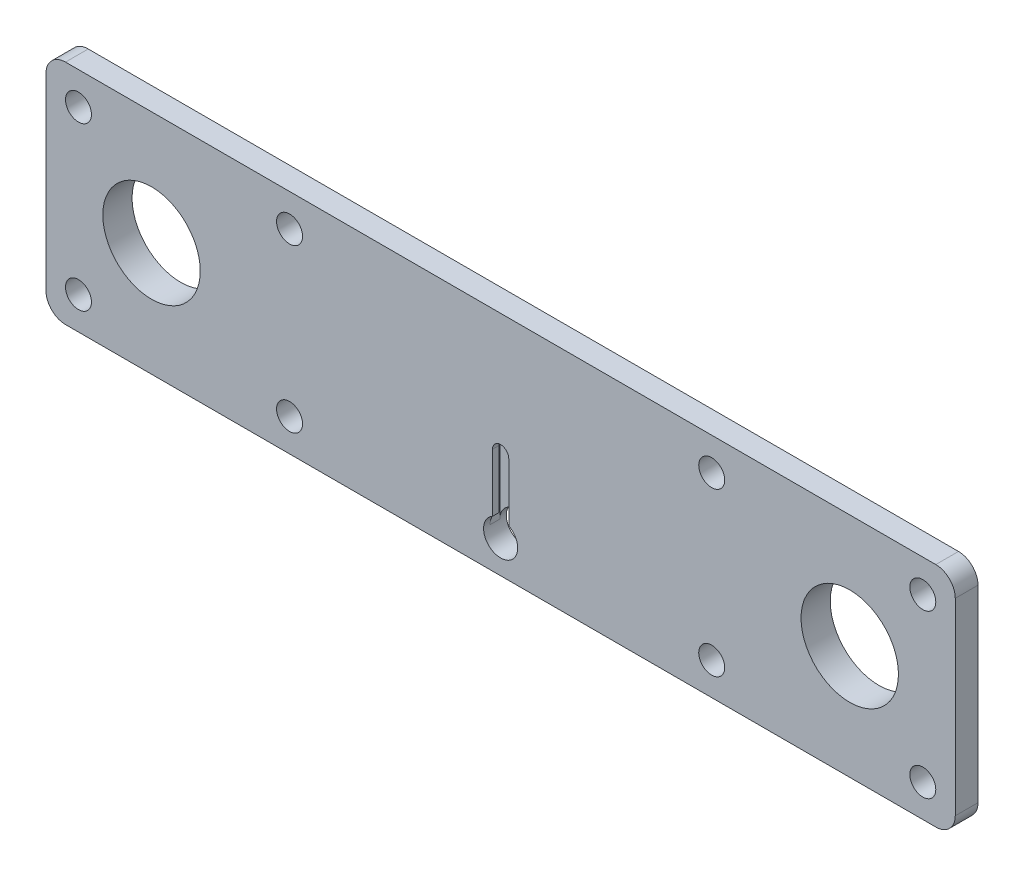
ISO-10303-21;
HEADER;
FILE_DESCRIPTION(('STEP AP214'),'2;1');
FILE_NAME('part.step','',(''),(''),'','','');
FILE_SCHEMA(('AUTOMOTIVE_DESIGN { 1 0 10303 214 1 1 1 1 }'));
ENDSEC;
DATA;
#1=APPLICATION_CONTEXT('core data for automotive mechanical design processes');
#2=APPLICATION_PROTOCOL_DEFINITION('international standard','automotive_design',2000,#1);
#3=PRODUCT_CONTEXT('',#1,'mechanical');
#4=PRODUCT('Part','Part','',(#3));
#5=PRODUCT_RELATED_PRODUCT_CATEGORY('part','',(#4));
#6=PRODUCT_DEFINITION_FORMATION('','',#4);
#7=PRODUCT_DEFINITION_CONTEXT('part definition',#1,'design');
#8=PRODUCT_DEFINITION('design','',#6,#7);
#9=PRODUCT_DEFINITION_SHAPE('','',#8);
#10=(LENGTH_UNIT() NAMED_UNIT(*) SI_UNIT(.MILLI.,.METRE.));
#11=(NAMED_UNIT(*) PLANE_ANGLE_UNIT() SI_UNIT($,.RADIAN.));
#12=(NAMED_UNIT(*) SI_UNIT($,.STERADIAN.) SOLID_ANGLE_UNIT());
#13=UNCERTAINTY_MEASURE_WITH_UNIT(LENGTH_MEASURE(1.E-05),#10,'distance_accuracy_value','');
#14=(GEOMETRIC_REPRESENTATION_CONTEXT(3) GLOBAL_UNCERTAINTY_ASSIGNED_CONTEXT((#13)) GLOBAL_UNIT_ASSIGNED_CONTEXT((#10,
#11,#12)) REPRESENTATION_CONTEXT('',''));
#15=CARTESIAN_POINT('',(0.,0.,0.));
#16=DIRECTION('',(0.,0.,1.));
#17=DIRECTION('',(1.,0.,0.));
#18=AXIS2_PLACEMENT_3D('',#15,#16,#17);
#19=CARTESIAN_POINT('',(0.,-2.5,10.));
#20=DIRECTION('',(0.,0.,-1.));
#21=DIRECTION('',(-1.,0.,0.));
#22=AXIS2_PLACEMENT_3D('',#19,#20,#21);
#23=CYLINDRICAL_SURFACE('',#22,2.5);
#24=CARTESIAN_POINT('',(0.,-2.5,2.));
#25=DIRECTION('',(0.,0.,1.));
#26=DIRECTION('',(1.,0.,0.));
#27=AXIS2_PLACEMENT_3D('',#24,#25,#26);
#28=CIRCLE('',#27,2.5);
#29=CARTESIAN_POINT('',(-2.5,-2.5,2.));
#30=VERTEX_POINT('',#29);
#31=CARTESIAN_POINT('',(2.5,-2.5,2.));
#32=VERTEX_POINT('',#31);
#33=EDGE_CURVE('E50',#30,#32,#28,.F.);
#34=ORIENTED_EDGE('',*,*,#33,.F.);
#35=DIRECTION('',(0.,0.,-1.));
#36=VECTOR('',#35,1.);
#37=CARTESIAN_POINT('',(-2.5,-2.5,10.));
#38=LINE('',#37,#36);
#39=CARTESIAN_POINT('',(-2.5,-2.5,0.));
#40=VERTEX_POINT('',#39);
#41=EDGE_CURVE('E261',#30,#40,#38,.T.);
#42=ORIENTED_EDGE('',*,*,#41,.T.);
#43=CARTESIAN_POINT('',(0.,-2.5,0.));
#44=DIRECTION('',(0.,0.,-1.));
#45=DIRECTION('',(1.,0.,0.));
#46=AXIS2_PLACEMENT_3D('',#43,#44,#45);
#47=CIRCLE('',#46,2.5);
#48=CARTESIAN_POINT('',(2.5,-2.5,0.));
#49=VERTEX_POINT('',#48);
#50=EDGE_CURVE('E245',#40,#49,#47,.T.);
#51=ORIENTED_EDGE('',*,*,#50,.T.);
#52=DIRECTION('',(0.,0.,-1.));
#53=VECTOR('',#52,1.);
#54=CARTESIAN_POINT('',(2.5,-2.5,10.));
#55=LINE('',#54,#53);
#56=EDGE_CURVE('E258',#32,#49,#55,.T.);
#57=ORIENTED_EDGE('',*,*,#56,.F.);
#58=EDGE_LOOP('',(#34,#42,#51,#57));
#59=FACE_BOUND('',#58,.T.);
#60=ADVANCED_FACE('F35',(#59),#23,.F.);
#61=CARTESIAN_POINT('',(-2.5,-2.5,10.));
#62=DIRECTION('',(-1.,0.,0.));
#63=DIRECTION('',(0.,0.,1.));
#64=AXIS2_PLACEMENT_3D('',#61,#62,#63);
#65=PLANE('',#64);
#66=DIRECTION('',(0.,1.,0.));
#67=VECTOR('',#66,1.);
#68=CARTESIAN_POINT('',(-2.5,-2.5,2.));
#69=LINE('',#68,#67);
#70=CARTESIAN_POINT('',(-2.5,-20.3834536718452,2.));
#71=VERTEX_POINT('',#70);
#72=EDGE_CURVE('E213',#71,#30,#69,.T.);
#73=ORIENTED_EDGE('',*,*,#72,.F.);
#74=DIRECTION('',(0.,0.,-1.));
#75=VECTOR('',#74,1.);
#76=CARTESIAN_POINT('',(-2.5,-20.3834536718452,10.));
#77=LINE('',#76,#75);
#78=CARTESIAN_POINT('',(-2.5,-20.3834536718452,0.));
#79=VERTEX_POINT('',#78);
#80=EDGE_CURVE('E265',#71,#79,#77,.T.);
#81=ORIENTED_EDGE('',*,*,#80,.T.);
#82=DIRECTION('',(0.,1.,0.));
#83=VECTOR('',#82,1.);
#84=CARTESIAN_POINT('',(-2.5,-2.5,0.));
#85=LINE('',#84,#83);
#86=EDGE_CURVE('E255',#79,#40,#85,.T.);
#87=ORIENTED_EDGE('',*,*,#86,.T.);
#88=ORIENTED_EDGE('',*,*,#41,.F.);
#89=EDGE_LOOP('',(#73,#81,#87,#88));
#90=FACE_BOUND('',#89,.T.);
#91=ADVANCED_FACE('F409',(#90),#65,.F.);
#92=CARTESIAN_POINT('',(2.5,-2.5,10.));
#93=DIRECTION('',(1.,0.,0.));
#94=DIRECTION('',(0.,0.,-1.));
#95=AXIS2_PLACEMENT_3D('',#92,#93,#94);
#96=PLANE('',#95);
#97=DIRECTION('',(0.,-1.,0.));
#98=VECTOR('',#97,1.);
#99=CARTESIAN_POINT('',(2.5,-2.5,2.));
#100=LINE('',#99,#98);
#101=CARTESIAN_POINT('',(2.5,-20.3834536718452,2.));
#102=VERTEX_POINT('',#101);
#103=EDGE_CURVE('E43',#32,#102,#100,.T.);
#104=ORIENTED_EDGE('',*,*,#103,.F.);
#105=ORIENTED_EDGE('',*,*,#56,.T.);
#106=DIRECTION('',(0.,-1.,0.));
#107=VECTOR('',#106,1.);
#108=CARTESIAN_POINT('',(2.5,-2.5,0.));
#109=LINE('',#108,#107);
#110=CARTESIAN_POINT('',(2.5,-20.3834536718452,0.));
#111=VERTEX_POINT('',#110);
#112=EDGE_CURVE('E248',#49,#111,#109,.T.);
#113=ORIENTED_EDGE('',*,*,#112,.T.);
#114=DIRECTION('',(0.,0.,-1.));
#115=VECTOR('',#114,1.);
#116=CARTESIAN_POINT('',(2.5,-20.3834536718452,10.));
#117=LINE('',#116,#115);
#118=EDGE_CURVE('E267',#102,#111,#117,.T.);
#119=ORIENTED_EDGE('',*,*,#118,.F.);
#120=EDGE_LOOP('',(#104,#105,#113,#119));
#121=FACE_BOUND('',#120,.T.);
#122=ADVANCED_FACE('F397',(#121),#96,.F.);
#123=CARTESIAN_POINT('',(0.,0.,0.));
#124=DIRECTION('',(0.,0.,1.));
#125=DIRECTION('',(1.,0.,0.));
#126=AXIS2_PLACEMENT_3D('',#123,#124,#125);
#127=PLANE('',#126);
#128=CARTESIAN_POINT('',(107.5,0.,0.));
#129=DIRECTION('',(0.,0.,1.));
#130=DIRECTION('',(1.,0.,0.));
#131=AXIS2_PLACEMENT_3D('',#128,#129,#130);
#132=CIRCLE('',#131,20.);
#133=CARTESIAN_POINT('',(127.5,0.,0.));
#134=VERTEX_POINT('',#133);
#135=EDGE_CURVE('E384',#134,#134,#132,.F.);
#136=ORIENTED_EDGE('',*,*,#135,.F.);
#137=EDGE_LOOP('',(#136));
#138=FACE_BOUND('',#137,.T.);
#139=CARTESIAN_POINT('',(-130.,-25.,0.));
#140=DIRECTION('',(0.,0.,-1.));
#141=DIRECTION('',(1.,0.,0.));
#142=AXIS2_PLACEMENT_3D('',#139,#140,#141);
#143=CIRCLE('',#142,3.99999999999996);
#144=CARTESIAN_POINT('',(-126.,-25.,0.));
#145=VERTEX_POINT('',#144);
#146=EDGE_CURVE('E236',#145,#145,#143,.T.);
#147=ORIENTED_EDGE('',*,*,#146,.F.);
#148=EDGE_LOOP('',(#147));
#149=FACE_BOUND('',#148,.T.);
#150=CARTESIAN_POINT('',(-65.,-25.,0.));
#151=DIRECTION('',(0.,0.,-1.));
#152=DIRECTION('',(1.,0.,0.));
#153=AXIS2_PLACEMENT_3D('',#150,#151,#152);
#154=CIRCLE('',#153,4.00000000000002);
#155=CARTESIAN_POINT('',(-61.,-25.,0.));
#156=VERTEX_POINT('',#155);
#157=EDGE_CURVE('E249',#156,#156,#154,.T.);
#158=ORIENTED_EDGE('',*,*,#157,.F.);
#159=EDGE_LOOP('',(#158));
#160=FACE_BOUND('',#159,.T.);
#161=ORIENTED_EDGE('',*,*,#112,.F.);
#162=ORIENTED_EDGE('',*,*,#50,.F.);
#163=ORIENTED_EDGE('',*,*,#86,.F.);
#164=CARTESIAN_POINT('',(0.,-25.,0.));
#165=DIRECTION('',(0.,0.,-1.));
#166=DIRECTION('',(1.,0.,0.));
#167=AXIS2_PLACEMENT_3D('',#164,#165,#166);
#168=CIRCLE('',#167,5.25);
#169=EDGE_CURVE('E252',#111,#79,#168,.T.);
#170=ORIENTED_EDGE('',*,*,#169,.F.);
#171=EDGE_LOOP('',(#161,#162,#163,#170));
#172=FACE_BOUND('',#171,.T.);
#173=CARTESIAN_POINT('',(65.,-25.,0.));
#174=DIRECTION('',(0.,0.,-1.));
#175=DIRECTION('',(1.,0.,0.));
#176=AXIS2_PLACEMENT_3D('',#173,#174,#175);
#177=CIRCLE('',#176,4.00000000000001);
#178=CARTESIAN_POINT('',(69.,-25.,0.));
#179=VERTEX_POINT('',#178);
#180=EDGE_CURVE('E241',#179,#179,#177,.T.);
#181=ORIENTED_EDGE('',*,*,#180,.F.);
#182=EDGE_LOOP('',(#181));
#183=FACE_BOUND('',#182,.T.);
#184=CARTESIAN_POINT('',(130.,25.,0.));
#185=DIRECTION('',(0.,0.,-1.));
#186=DIRECTION('',(-1.,0.,0.));
#187=AXIS2_PLACEMENT_3D('',#184,#185,#186);
#188=CIRCLE('',#187,3.99999999999999);
#189=CARTESIAN_POINT('',(126.,25.,0.));
#190=VERTEX_POINT('',#189);
#191=EDGE_CURVE('E237',#190,#190,#188,.T.);
#192=ORIENTED_EDGE('',*,*,#191,.F.);
#193=EDGE_LOOP('',(#192));
#194=FACE_BOUND('',#193,.T.);
#195=CARTESIAN_POINT('',(65.,25.,0.));
#196=DIRECTION('',(0.,0.,-1.));
#197=DIRECTION('',(-1.,0.,0.));
#198=AXIS2_PLACEMENT_3D('',#195,#196,#197);
#199=CIRCLE('',#198,4.00000000000001);
#200=CARTESIAN_POINT('',(61.,25.,0.));
#201=VERTEX_POINT('',#200);
#202=EDGE_CURVE('E240',#201,#201,#199,.T.);
#203=ORIENTED_EDGE('',*,*,#202,.F.);
#204=EDGE_LOOP('',(#203));
#205=FACE_BOUND('',#204,.T.);
#206=CARTESIAN_POINT('',(-65.,25.,0.));
#207=DIRECTION('',(0.,0.,-1.));
#208=DIRECTION('',(-1.,0.,0.));
#209=AXIS2_PLACEMENT_3D('',#206,#207,#208);
#210=CIRCLE('',#209,4.00000000000002);
#211=CARTESIAN_POINT('',(-69.,25.,0.));
#212=VERTEX_POINT('',#211);
#213=EDGE_CURVE('E282',#212,#212,#210,.T.);
#214=ORIENTED_EDGE('',*,*,#213,.F.);
#215=EDGE_LOOP('',(#214));
#216=FACE_BOUND('',#215,.T.);
#217=CARTESIAN_POINT('',(130.,-25.,0.));
#218=DIRECTION('',(0.,0.,-1.));
#219=DIRECTION('',(1.,0.,0.));
#220=AXIS2_PLACEMENT_3D('',#217,#218,#219);
#221=CIRCLE('',#220,3.99999999999999);
#222=CARTESIAN_POINT('',(134.,-25.,0.));
#223=VERTEX_POINT('',#222);
#224=EDGE_CURVE('E279',#223,#223,#221,.T.);
#225=ORIENTED_EDGE('',*,*,#224,.F.);
#226=EDGE_LOOP('',(#225));
#227=FACE_BOUND('',#226,.T.);
#228=CARTESIAN_POINT('',(-130.,25.,0.));
#229=DIRECTION('',(0.,0.,-1.));
#230=DIRECTION('',(-1.,0.,0.));
#231=AXIS2_PLACEMENT_3D('',#228,#229,#230);
#232=CIRCLE('',#231,3.99999999999996);
#233=CARTESIAN_POINT('',(-134.,25.,0.));
#234=VERTEX_POINT('',#233);
#235=EDGE_CURVE('E275',#234,#234,#232,.T.);
#236=ORIENTED_EDGE('',*,*,#235,.F.);
#237=EDGE_LOOP('',(#236));
#238=FACE_BOUND('',#237,.T.);
#239=DIRECTION('',(0.,1.,0.));
#240=VECTOR('',#239,1.);
#241=CARTESIAN_POINT('',(140.,35.,0.));
#242=LINE('',#241,#240);
#243=CARTESIAN_POINT('',(140.,-29.,0.));
#244=VERTEX_POINT('',#243);
#245=CARTESIAN_POINT('',(140.,29.,0.));
#246=VERTEX_POINT('',#245);
#247=EDGE_CURVE('E324',#244,#246,#242,.T.);
#248=ORIENTED_EDGE('',*,*,#247,.F.);
#249=CARTESIAN_POINT('',(134.,-29.,0.));
#250=DIRECTION('',(0.,0.,1.));
#251=DIRECTION('',(1.,0.,0.));
#252=AXIS2_PLACEMENT_3D('',#249,#250,#251);
#253=CIRCLE('',#252,6.);
#254=CARTESIAN_POINT('',(134.,-35.,0.));
#255=VERTEX_POINT('',#254);
#256=EDGE_CURVE('E359',#244,#255,#253,.F.);
#257=ORIENTED_EDGE('',*,*,#256,.T.);
#258=DIRECTION('',(1.,0.,0.));
#259=VECTOR('',#258,1.);
#260=CARTESIAN_POINT('',(-140.,-35.,0.));
#261=LINE('',#260,#259);
#262=CARTESIAN_POINT('',(-134.,-35.,0.));
#263=VERTEX_POINT('',#262);
#264=EDGE_CURVE('E329',#263,#255,#261,.T.);
#265=ORIENTED_EDGE('',*,*,#264,.F.);
#266=CARTESIAN_POINT('',(-134.,-29.,0.));
#267=DIRECTION('',(0.,0.,1.));
#268=DIRECTION('',(1.,0.,0.));
#269=AXIS2_PLACEMENT_3D('',#266,#267,#268);
#270=CIRCLE('',#269,6.);
#271=CARTESIAN_POINT('',(-140.,-29.,0.));
#272=VERTEX_POINT('',#271);
#273=EDGE_CURVE('E355',#263,#272,#270,.F.);
#274=ORIENTED_EDGE('',*,*,#273,.T.);
#275=DIRECTION('',(0.,-1.,0.));
#276=VECTOR('',#275,1.);
#277=CARTESIAN_POINT('',(-140.,35.,0.));
#278=LINE('',#277,#276);
#279=CARTESIAN_POINT('',(-140.,29.,0.));
#280=VERTEX_POINT('',#279);
#281=EDGE_CURVE('E344',#280,#272,#278,.T.);
#282=ORIENTED_EDGE('',*,*,#281,.F.);
#283=CARTESIAN_POINT('',(-134.,29.,0.));
#284=DIRECTION('',(0.,0.,1.));
#285=DIRECTION('',(1.,0.,0.));
#286=AXIS2_PLACEMENT_3D('',#283,#284,#285);
#287=CIRCLE('',#286,6.);
#288=CARTESIAN_POINT('',(-134.,35.,0.));
#289=VERTEX_POINT('',#288);
#290=EDGE_CURVE('E353',#280,#289,#287,.F.);
#291=ORIENTED_EDGE('',*,*,#290,.T.);
#292=DIRECTION('',(-1.,0.,0.));
#293=VECTOR('',#292,1.);
#294=CARTESIAN_POINT('',(-140.,35.,0.));
#295=LINE('',#294,#293);
#296=CARTESIAN_POINT('',(134.,35.,0.));
#297=VERTEX_POINT('',#296);
#298=EDGE_CURVE('E341',#297,#289,#295,.T.);
#299=ORIENTED_EDGE('',*,*,#298,.F.);
#300=CARTESIAN_POINT('',(134.,29.,0.));
#301=DIRECTION('',(0.,0.,1.));
#302=DIRECTION('',(1.,0.,0.));
#303=AXIS2_PLACEMENT_3D('',#300,#301,#302);
#304=CIRCLE('',#303,6.);
#305=EDGE_CURVE('E357',#297,#246,#304,.F.);
#306=ORIENTED_EDGE('',*,*,#305,.T.);
#307=EDGE_LOOP('',(#248,#257,#265,#274,#282,#291,#299,#306));
#308=FACE_BOUND('',#307,.T.);
#309=CARTESIAN_POINT('',(-107.5,0.,0.));
#310=DIRECTION('',(0.,0.,1.));
#311=DIRECTION('',(1.,0.,0.));
#312=AXIS2_PLACEMENT_3D('',#309,#310,#311);
#313=CIRCLE('',#312,20.);
#314=CARTESIAN_POINT('',(-87.5,0.,0.));
#315=VERTEX_POINT('',#314);
#316=EDGE_CURVE('E387',#315,#315,#313,.F.);
#317=ORIENTED_EDGE('',*,*,#316,.F.);
#318=EDGE_LOOP('',(#317));
#319=FACE_BOUND('',#318,.T.);
#320=ADVANCED_FACE('F403',(#138,#149,#160,#172,#183,#194,#205,#216,#227,#238,#308,#319),#127,.F.);
#321=CARTESIAN_POINT('',(140.,35.,7.));
#322=DIRECTION('',(-1.,0.,0.));
#323=DIRECTION('',(0.,0.,1.));
#324=AXIS2_PLACEMENT_3D('',#321,#322,#323);
#325=PLANE('',#324);
#326=DIRECTION('',(0.,1.,0.));
#327=VECTOR('',#326,1.);
#328=CARTESIAN_POINT('',(140.,35.,7.));
#329=LINE('',#328,#327);
#330=CARTESIAN_POINT('',(140.,-29.,7.));
#331=VERTEX_POINT('',#330);
#332=CARTESIAN_POINT('',(140.,29.,7.));
#333=VERTEX_POINT('',#332);
#334=EDGE_CURVE('E325',#331,#333,#329,.T.);
#335=ORIENTED_EDGE('',*,*,#334,.F.);
#336=DIRECTION('',(0.,0.,-1.));
#337=VECTOR('',#336,1.);
#338=CARTESIAN_POINT('',(140.,-29.,7.));
#339=LINE('',#338,#337);
#340=EDGE_CURVE('E350',#331,#244,#339,.T.);
#341=ORIENTED_EDGE('',*,*,#340,.T.);
#342=ORIENTED_EDGE('',*,*,#247,.T.);
#343=DIRECTION('',(0.,0.,-1.));
#344=VECTOR('',#343,1.);
#345=CARTESIAN_POINT('',(140.,29.,7.));
#346=LINE('',#345,#344);
#347=EDGE_CURVE('E338',#246,#333,#346,.F.);
#348=ORIENTED_EDGE('',*,*,#347,.T.);
#349=EDGE_LOOP('',(#335,#341,#342,#348));
#350=FACE_BOUND('',#349,.T.);
#351=ADVANCED_FACE('F491',(#350),#325,.F.);
#352=CARTESIAN_POINT('',(-140.,35.,7.));
#353=DIRECTION('',(0.,-1.,0.));
#354=DIRECTION('',(0.,0.,-1.));
#355=AXIS2_PLACEMENT_3D('',#352,#353,#354);
#356=PLANE('',#355);
#357=DIRECTION('',(-1.,0.,0.));
#358=VECTOR('',#357,1.);
#359=CARTESIAN_POINT('',(-140.,35.,7.));
#360=LINE('',#359,#358);
#361=CARTESIAN_POINT('',(134.,35.,7.));
#362=VERTEX_POINT('',#361);
#363=CARTESIAN_POINT('',(-134.,35.,7.));
#364=VERTEX_POINT('',#363);
#365=EDGE_CURVE('E328',#362,#364,#360,.T.);
#366=ORIENTED_EDGE('',*,*,#365,.F.);
#367=DIRECTION('',(0.,0.,-1.));
#368=VECTOR('',#367,1.);
#369=CARTESIAN_POINT('',(134.,35.,7.));
#370=LINE('',#369,#368);
#371=EDGE_CURVE('E376',#362,#297,#370,.T.);
#372=ORIENTED_EDGE('',*,*,#371,.T.);
#373=ORIENTED_EDGE('',*,*,#298,.T.);
#374=DIRECTION('',(0.,0.,-1.));
#375=VECTOR('',#374,1.);
#376=CARTESIAN_POINT('',(-134.,35.,7.));
#377=LINE('',#376,#375);
#378=EDGE_CURVE('E374',#289,#364,#377,.F.);
#379=ORIENTED_EDGE('',*,*,#378,.T.);
#380=EDGE_LOOP('',(#366,#372,#373,#379));
#381=FACE_BOUND('',#380,.T.);
#382=ADVANCED_FACE('F497',(#381),#356,.F.);
#383=CARTESIAN_POINT('',(-140.,35.,7.));
#384=DIRECTION('',(1.,0.,0.));
#385=DIRECTION('',(0.,0.,-1.));
#386=AXIS2_PLACEMENT_3D('',#383,#384,#385);
#387=PLANE('',#386);
#388=ORIENTED_EDGE('',*,*,#281,.T.);
#389=DIRECTION('',(0.,0.,-1.));
#390=VECTOR('',#389,1.);
#391=CARTESIAN_POINT('',(-140.,-29.,7.));
#392=LINE('',#391,#390);
#393=CARTESIAN_POINT('',(-140.,-29.,7.));
#394=VERTEX_POINT('',#393);
#395=EDGE_CURVE('E382',#272,#394,#392,.F.);
#396=ORIENTED_EDGE('',*,*,#395,.T.);
#397=DIRECTION('',(0.,-1.,0.));
#398=VECTOR('',#397,1.);
#399=CARTESIAN_POINT('',(-140.,35.,7.));
#400=LINE('',#399,#398);
#401=CARTESIAN_POINT('',(-140.,29.,7.));
#402=VERTEX_POINT('',#401);
#403=EDGE_CURVE('E332',#402,#394,#400,.T.);
#404=ORIENTED_EDGE('',*,*,#403,.F.);
#405=DIRECTION('',(0.,0.,-1.));
#406=VECTOR('',#405,1.);
#407=CARTESIAN_POINT('',(-140.,29.,7.));
#408=LINE('',#407,#406);
#409=EDGE_CURVE('E379',#402,#280,#408,.T.);
#410=ORIENTED_EDGE('',*,*,#409,.T.);
#411=EDGE_LOOP('',(#388,#396,#404,#410));
#412=FACE_BOUND('',#411,.T.);
#413=ADVANCED_FACE('F508',(#412),#387,.F.);
#414=CARTESIAN_POINT('',(-140.,-35.,7.));
#415=DIRECTION('',(0.,1.,0.));
#416=DIRECTION('',(0.,0.,1.));
#417=AXIS2_PLACEMENT_3D('',#414,#415,#416);
#418=PLANE('',#417);
#419=ORIENTED_EDGE('',*,*,#264,.T.);
#420=DIRECTION('',(0.,0.,-1.));
#421=VECTOR('',#420,1.);
#422=CARTESIAN_POINT('',(134.,-35.,7.));
#423=LINE('',#422,#421);
#424=CARTESIAN_POINT('',(134.,-35.,7.));
#425=VERTEX_POINT('',#424);
#426=EDGE_CURVE('E364',#255,#425,#423,.F.);
#427=ORIENTED_EDGE('',*,*,#426,.T.);
#428=DIRECTION('',(1.,0.,0.));
#429=VECTOR('',#428,1.);
#430=CARTESIAN_POINT('',(-140.,-35.,7.));
#431=LINE('',#430,#429);
#432=CARTESIAN_POINT('',(-134.,-35.,7.));
#433=VERTEX_POINT('',#432);
#434=EDGE_CURVE('E335',#433,#425,#431,.T.);
#435=ORIENTED_EDGE('',*,*,#434,.F.);
#436=DIRECTION('',(0.,0.,-1.));
#437=VECTOR('',#436,1.);
#438=CARTESIAN_POINT('',(-134.,-35.,7.));
#439=LINE('',#438,#437);
#440=EDGE_CURVE('E361',#433,#263,#439,.T.);
#441=ORIENTED_EDGE('',*,*,#440,.T.);
#442=EDGE_LOOP('',(#419,#427,#435,#441));
#443=FACE_BOUND('',#442,.T.);
#444=ADVANCED_FACE('F505',(#443),#418,.F.);
#445=CARTESIAN_POINT('',(0.,0.,7.));
#446=DIRECTION('',(0.,0.,1.));
#447=DIRECTION('',(1.,0.,0.));
#448=AXIS2_PLACEMENT_3D('',#445,#446,#447);
#449=PLANE('',#448);
#450=CARTESIAN_POINT('',(-130.,-25.,7.));
#451=DIRECTION('',(0.,0.,1.));
#452=DIRECTION('',(1.,0.,0.));
#453=AXIS2_PLACEMENT_3D('',#450,#451,#452);
#454=CIRCLE('',#453,3.99999999999996);
#455=CARTESIAN_POINT('',(-126.,-25.,7.));
#456=VERTEX_POINT('',#455);
#457=EDGE_CURVE('E318',#456,#456,#454,.T.);
#458=ORIENTED_EDGE('',*,*,#457,.F.);
#459=EDGE_LOOP('',(#458));
#460=FACE_BOUND('',#459,.T.);
#461=CARTESIAN_POINT('',(-65.,-25.,7.));
#462=DIRECTION('',(0.,0.,1.));
#463=DIRECTION('',(1.,0.,0.));
#464=AXIS2_PLACEMENT_3D('',#461,#462,#463);
#465=CIRCLE('',#464,4.00000000000002);
#466=CARTESIAN_POINT('',(-61.,-25.,7.));
#467=VERTEX_POINT('',#466);
#468=EDGE_CURVE('E315',#467,#467,#465,.T.);
#469=ORIENTED_EDGE('',*,*,#468,.F.);
#470=EDGE_LOOP('',(#469));
#471=FACE_BOUND('',#470,.T.);
#472=CARTESIAN_POINT('',(0.,-2.5,7.));
#473=DIRECTION('',(0.,0.,1.));
#474=DIRECTION('',(1.,0.,0.));
#475=AXIS2_PLACEMENT_3D('',#472,#473,#474);
#476=CIRCLE('',#475,2.5);
#477=CARTESIAN_POINT('',(2.5,-2.5,7.));
#478=VERTEX_POINT('',#477);
#479=CARTESIAN_POINT('',(-2.5,-2.5,7.));
#480=VERTEX_POINT('',#479);
#481=EDGE_CURVE('E313',#478,#480,#476,.T.);
#482=ORIENTED_EDGE('',*,*,#481,.F.);
#483=DIRECTION('',(0.,1.,0.));
#484=VECTOR('',#483,1.);
#485=CARTESIAN_POINT('',(2.5,0.,7.));
#486=LINE('',#485,#484);
#487=CARTESIAN_POINT('',(2.5,-20.3834536718452,7.));
#488=VERTEX_POINT('',#487);
#489=EDGE_CURVE('E307',#488,#478,#486,.T.);
#490=ORIENTED_EDGE('',*,*,#489,.F.);
#491=CARTESIAN_POINT('',(0.,-25.,7.));
#492=DIRECTION('',(0.,0.,1.));
#493=DIRECTION('',(1.,0.,0.));
#494=AXIS2_PLACEMENT_3D('',#491,#492,#493);
#495=CIRCLE('',#494,5.25);
#496=CARTESIAN_POINT('',(-2.5,-20.3834536718452,7.));
#497=VERTEX_POINT('',#496);
#498=EDGE_CURVE('E309',#497,#488,#495,.T.);
#499=ORIENTED_EDGE('',*,*,#498,.F.);
#500=DIRECTION('',(0.,-1.,0.));
#501=VECTOR('',#500,1.);
#502=CARTESIAN_POINT('',(-2.5,0.,7.));
#503=LINE('',#502,#501);
#504=EDGE_CURVE('E311',#480,#497,#503,.T.);
#505=ORIENTED_EDGE('',*,*,#504,.F.);
#506=EDGE_LOOP('',(#482,#490,#499,#505));
#507=FACE_BOUND('',#506,.T.);
#508=CARTESIAN_POINT('',(65.,-25.,7.));
#509=DIRECTION('',(0.,0.,1.));
#510=DIRECTION('',(1.,0.,0.));
#511=AXIS2_PLACEMENT_3D('',#508,#509,#510);
#512=CIRCLE('',#511,4.00000000000001);
#513=CARTESIAN_POINT('',(69.,-25.,7.));
#514=VERTEX_POINT('',#513);
#515=EDGE_CURVE('E304',#514,#514,#512,.T.);
#516=ORIENTED_EDGE('',*,*,#515,.F.);
#517=EDGE_LOOP('',(#516));
#518=FACE_BOUND('',#517,.T.);
#519=CARTESIAN_POINT('',(130.,25.,7.));
#520=DIRECTION('',(0.,0.,1.));
#521=DIRECTION('',(1.,0.,0.));
#522=AXIS2_PLACEMENT_3D('',#519,#520,#521);
#523=CIRCLE('',#522,3.99999999999999);
#524=CARTESIAN_POINT('',(134.,25.,7.));
#525=VERTEX_POINT('',#524);
#526=EDGE_CURVE('E301',#525,#525,#523,.T.);
#527=ORIENTED_EDGE('',*,*,#526,.F.);
#528=EDGE_LOOP('',(#527));
#529=FACE_BOUND('',#528,.T.);
#530=CARTESIAN_POINT('',(65.,25.,7.));
#531=DIRECTION('',(0.,0.,1.));
#532=DIRECTION('',(1.,0.,0.));
#533=AXIS2_PLACEMENT_3D('',#530,#531,#532);
#534=CIRCLE('',#533,4.00000000000001);
#535=CARTESIAN_POINT('',(69.,25.,7.));
#536=VERTEX_POINT('',#535);
#537=EDGE_CURVE('E298',#536,#536,#534,.T.);
#538=ORIENTED_EDGE('',*,*,#537,.F.);
#539=EDGE_LOOP('',(#538));
#540=FACE_BOUND('',#539,.T.);
#541=CARTESIAN_POINT('',(-65.,25.,7.));
#542=DIRECTION('',(0.,0.,1.));
#543=DIRECTION('',(1.,0.,0.));
#544=AXIS2_PLACEMENT_3D('',#541,#542,#543);
#545=CIRCLE('',#544,4.00000000000002);
#546=CARTESIAN_POINT('',(-61.,25.,7.));
#547=VERTEX_POINT('',#546);
#548=EDGE_CURVE('E295',#547,#547,#545,.T.);
#549=ORIENTED_EDGE('',*,*,#548,.F.);
#550=EDGE_LOOP('',(#549));
#551=FACE_BOUND('',#550,.T.);
#552=CARTESIAN_POINT('',(130.,-25.,7.));
#553=DIRECTION('',(0.,0.,1.));
#554=DIRECTION('',(1.,0.,0.));
#555=AXIS2_PLACEMENT_3D('',#552,#553,#554);
#556=CIRCLE('',#555,3.99999999999999);
#557=CARTESIAN_POINT('',(134.,-25.,7.));
#558=VERTEX_POINT('',#557);
#559=EDGE_CURVE('E292',#558,#558,#556,.T.);
#560=ORIENTED_EDGE('',*,*,#559,.F.);
#561=EDGE_LOOP('',(#560));
#562=FACE_BOUND('',#561,.T.);
#563=CARTESIAN_POINT('',(-130.,25.,7.));
#564=DIRECTION('',(0.,0.,1.));
#565=DIRECTION('',(1.,0.,0.));
#566=AXIS2_PLACEMENT_3D('',#563,#564,#565);
#567=CIRCLE('',#566,3.99999999999996);
#568=CARTESIAN_POINT('',(-126.,25.,7.));
#569=VERTEX_POINT('',#568);
#570=EDGE_CURVE('E289',#569,#569,#567,.T.);
#571=ORIENTED_EDGE('',*,*,#570,.F.);
#572=EDGE_LOOP('',(#571));
#573=FACE_BOUND('',#572,.T.);
#574=CARTESIAN_POINT('',(-107.5,0.,7.));
#575=DIRECTION('',(0.,0.,1.));
#576=DIRECTION('',(1.,0.,0.));
#577=AXIS2_PLACEMENT_3D('',#574,#575,#576);
#578=CIRCLE('',#577,15.);
#579=CARTESIAN_POINT('',(-92.5,0.,7.));
#580=VERTEX_POINT('',#579);
#581=EDGE_CURVE('E278',#580,#580,#578,.T.);
#582=ORIENTED_EDGE('',*,*,#581,.F.);
#583=EDGE_LOOP('',(#582));
#584=FACE_BOUND('',#583,.T.);
#585=CARTESIAN_POINT('',(107.5,0.,7.));
#586=DIRECTION('',(0.,0.,1.));
#587=DIRECTION('',(1.,0.,0.));
#588=AXIS2_PLACEMENT_3D('',#585,#586,#587);
#589=CIRCLE('',#588,15.);
#590=CARTESIAN_POINT('',(122.5,0.,7.));
#591=VERTEX_POINT('',#590);
#592=EDGE_CURVE('E321',#591,#591,#589,.T.);
#593=ORIENTED_EDGE('',*,*,#592,.F.);
#594=EDGE_LOOP('',(#593));
#595=FACE_BOUND('',#594,.T.);
#596=ORIENTED_EDGE('',*,*,#434,.T.);
#597=CARTESIAN_POINT('',(134.,-29.,7.));
#598=DIRECTION('',(0.,0.,1.));
#599=DIRECTION('',(1.,0.,0.));
#600=AXIS2_PLACEMENT_3D('',#597,#598,#599);
#601=CIRCLE('',#600,6.);
#602=EDGE_CURVE('E372',#425,#331,#601,.T.);
#603=ORIENTED_EDGE('',*,*,#602,.T.);
#604=ORIENTED_EDGE('',*,*,#334,.T.);
#605=CARTESIAN_POINT('',(134.,29.,7.));
#606=DIRECTION('',(0.,0.,1.));
#607=DIRECTION('',(1.,0.,0.));
#608=AXIS2_PLACEMENT_3D('',#605,#606,#607);
#609=CIRCLE('',#608,6.);
#610=EDGE_CURVE('E370',#333,#362,#609,.T.);
#611=ORIENTED_EDGE('',*,*,#610,.T.);
#612=ORIENTED_EDGE('',*,*,#365,.T.);
#613=CARTESIAN_POINT('',(-134.,29.,7.));
#614=DIRECTION('',(0.,0.,1.));
#615=DIRECTION('',(1.,0.,0.));
#616=AXIS2_PLACEMENT_3D('',#613,#614,#615);
#617=CIRCLE('',#616,6.);
#618=EDGE_CURVE('E366',#364,#402,#617,.T.);
#619=ORIENTED_EDGE('',*,*,#618,.T.);
#620=ORIENTED_EDGE('',*,*,#403,.T.);
#621=CARTESIAN_POINT('',(-134.,-29.,7.));
#622=DIRECTION('',(0.,0.,1.));
#623=DIRECTION('',(1.,0.,0.));
#624=AXIS2_PLACEMENT_3D('',#621,#622,#623);
#625=CIRCLE('',#624,6.);
#626=EDGE_CURVE('E368',#394,#433,#625,.T.);
#627=ORIENTED_EDGE('',*,*,#626,.T.);
#628=EDGE_LOOP('',(#596,#603,#604,#611,#612,#619,#620,#627));
#629=FACE_BOUND('',#628,.T.);
#630=ADVANCED_FACE('F441',(#460,#471,#507,#518,#529,#540,#551,#562,#573,#584,#595,#629),#449,.T.);
#631=CARTESIAN_POINT('',(134.,-29.,7.));
#632=DIRECTION('',(0.,0.,-1.));
#633=DIRECTION('',(-1.,0.,0.));
#634=AXIS2_PLACEMENT_3D('',#631,#632,#633);
#635=CYLINDRICAL_SURFACE('',#634,6.);
#636=ORIENTED_EDGE('',*,*,#602,.F.);
#637=ORIENTED_EDGE('',*,*,#426,.F.);
#638=ORIENTED_EDGE('',*,*,#256,.F.);
#639=ORIENTED_EDGE('',*,*,#340,.F.);
#640=EDGE_LOOP('',(#636,#637,#638,#639));
#641=FACE_BOUND('',#640,.T.);
#642=ADVANCED_FACE('F516',(#641),#635,.T.);
#643=CARTESIAN_POINT('',(134.,29.,7.));
#644=DIRECTION('',(0.,0.,-1.));
#645=DIRECTION('',(-1.,0.,0.));
#646=AXIS2_PLACEMENT_3D('',#643,#644,#645);
#647=CYLINDRICAL_SURFACE('',#646,6.);
#648=ORIENTED_EDGE('',*,*,#610,.F.);
#649=ORIENTED_EDGE('',*,*,#347,.F.);
#650=ORIENTED_EDGE('',*,*,#305,.F.);
#651=ORIENTED_EDGE('',*,*,#371,.F.);
#652=EDGE_LOOP('',(#648,#649,#650,#651));
#653=FACE_BOUND('',#652,.T.);
#654=ADVANCED_FACE('F519',(#653),#647,.T.);
#655=CARTESIAN_POINT('',(-134.,-29.,7.));
#656=DIRECTION('',(0.,0.,-1.));
#657=DIRECTION('',(-1.,0.,0.));
#658=AXIS2_PLACEMENT_3D('',#655,#656,#657);
#659=CYLINDRICAL_SURFACE('',#658,6.);
#660=ORIENTED_EDGE('',*,*,#626,.F.);
#661=ORIENTED_EDGE('',*,*,#395,.F.);
#662=ORIENTED_EDGE('',*,*,#273,.F.);
#663=ORIENTED_EDGE('',*,*,#440,.F.);
#664=EDGE_LOOP('',(#660,#661,#662,#663));
#665=FACE_BOUND('',#664,.T.);
#666=ADVANCED_FACE('F522',(#665),#659,.T.);
#667=CARTESIAN_POINT('',(-134.,29.,7.));
#668=DIRECTION('',(0.,0.,-1.));
#669=DIRECTION('',(-1.,0.,0.));
#670=AXIS2_PLACEMENT_3D('',#667,#668,#669);
#671=CYLINDRICAL_SURFACE('',#670,6.);
#672=ORIENTED_EDGE('',*,*,#618,.F.);
#673=ORIENTED_EDGE('',*,*,#378,.F.);
#674=ORIENTED_EDGE('',*,*,#290,.F.);
#675=ORIENTED_EDGE('',*,*,#409,.F.);
#676=EDGE_LOOP('',(#672,#673,#674,#675));
#677=FACE_BOUND('',#676,.T.);
#678=ADVANCED_FACE('F37',(#677),#671,.T.);
#679=CARTESIAN_POINT('',(107.5,0.,10.));
#680=DIRECTION('',(0.,0.,-1.));
#681=DIRECTION('',(-1.,0.,0.));
#682=AXIS2_PLACEMENT_3D('',#679,#680,#681);
#683=CYLINDRICAL_SURFACE('',#682,15.);
#684=ORIENTED_EDGE('',*,*,#592,.T.);
#685=EDGE_LOOP('',(#684));
#686=FACE_BOUND('',#685,.T.);
#687=CARTESIAN_POINT('',(107.5,0.,-2.));
#688=DIRECTION('',(0.,0.,-1.));
#689=DIRECTION('',(-1.,0.,0.));
#690=AXIS2_PLACEMENT_3D('',#687,#688,#689);
#691=CIRCLE('',#690,15.);
#692=CARTESIAN_POINT('',(92.5,0.,-2.));
#693=VERTEX_POINT('',#692);
#694=EDGE_CURVE('E230',#693,#693,#691,.T.);
#695=ORIENTED_EDGE('',*,*,#694,.T.);
#696=EDGE_LOOP('',(#695));
#697=FACE_BOUND('',#696,.T.);
#698=ADVANCED_FACE('F529',(#686,#697),#683,.F.);
#699=CARTESIAN_POINT('',(-107.5,0.,10.));
#700=DIRECTION('',(0.,0.,-1.));
#701=DIRECTION('',(-1.,0.,0.));
#702=AXIS2_PLACEMENT_3D('',#699,#700,#701);
#703=CYLINDRICAL_SURFACE('',#702,15.);
#704=ORIENTED_EDGE('',*,*,#581,.T.);
#705=EDGE_LOOP('',(#704));
#706=FACE_BOUND('',#705,.T.);
#707=CARTESIAN_POINT('',(-107.5,0.,-2.));
#708=DIRECTION('',(0.,0.,-1.));
#709=DIRECTION('',(-1.,0.,0.));
#710=AXIS2_PLACEMENT_3D('',#707,#708,#709);
#711=CIRCLE('',#710,15.);
#712=CARTESIAN_POINT('',(-122.5,0.,-2.));
#713=VERTEX_POINT('',#712);
#714=EDGE_CURVE('E224',#713,#713,#711,.T.);
#715=ORIENTED_EDGE('',*,*,#714,.T.);
#716=EDGE_LOOP('',(#715));
#717=FACE_BOUND('',#716,.T.);
#718=ADVANCED_FACE('F574',(#706,#717),#703,.F.);
#719=CARTESIAN_POINT('',(-130.,25.,10.));
#720=DIRECTION('',(0.,0.,-1.));
#721=DIRECTION('',(-1.,0.,0.));
#722=AXIS2_PLACEMENT_3D('',#719,#720,#721);
#723=CYLINDRICAL_SURFACE('',#722,3.99999999999996);
#724=ORIENTED_EDGE('',*,*,#570,.T.);
#725=EDGE_LOOP('',(#724));
#726=FACE_BOUND('',#725,.T.);
#727=ORIENTED_EDGE('',*,*,#235,.T.);
#728=EDGE_LOOP('',(#727));
#729=FACE_BOUND('',#728,.T.);
#730=ADVANCED_FACE('F577',(#726,#729),#723,.F.);
#731=CARTESIAN_POINT('',(130.,-25.,10.));
#732=DIRECTION('',(0.,0.,-1.));
#733=DIRECTION('',(-1.,0.,0.));
#734=AXIS2_PLACEMENT_3D('',#731,#732,#733);
#735=CYLINDRICAL_SURFACE('',#734,3.99999999999999);
#736=ORIENTED_EDGE('',*,*,#559,.T.);
#737=EDGE_LOOP('',(#736));
#738=FACE_BOUND('',#737,.T.);
#739=ORIENTED_EDGE('',*,*,#224,.T.);
#740=EDGE_LOOP('',(#739));
#741=FACE_BOUND('',#740,.T.);
#742=ADVANCED_FACE('F581',(#738,#741),#735,.F.);
#743=CARTESIAN_POINT('',(-65.,25.,10.));
#744=DIRECTION('',(0.,0.,-1.));
#745=DIRECTION('',(-1.,0.,0.));
#746=AXIS2_PLACEMENT_3D('',#743,#744,#745);
#747=CYLINDRICAL_SURFACE('',#746,4.00000000000002);
#748=ORIENTED_EDGE('',*,*,#548,.T.);
#749=EDGE_LOOP('',(#748));
#750=FACE_BOUND('',#749,.T.);
#751=ORIENTED_EDGE('',*,*,#213,.T.);
#752=EDGE_LOOP('',(#751));
#753=FACE_BOUND('',#752,.T.);
#754=ADVANCED_FACE('F585',(#750,#753),#747,.F.);
#755=CARTESIAN_POINT('',(65.,25.,10.));
#756=DIRECTION('',(0.,0.,-1.));
#757=DIRECTION('',(-1.,0.,0.));
#758=AXIS2_PLACEMENT_3D('',#755,#756,#757);
#759=CYLINDRICAL_SURFACE('',#758,4.00000000000001);
#760=ORIENTED_EDGE('',*,*,#537,.T.);
#761=EDGE_LOOP('',(#760));
#762=FACE_BOUND('',#761,.T.);
#763=ORIENTED_EDGE('',*,*,#202,.T.);
#764=EDGE_LOOP('',(#763));
#765=FACE_BOUND('',#764,.T.);
#766=ADVANCED_FACE('F476',(#762,#765),#759,.F.);
#767=CARTESIAN_POINT('',(130.,25.,10.));
#768=DIRECTION('',(0.,0.,-1.));
#769=DIRECTION('',(-1.,0.,0.));
#770=AXIS2_PLACEMENT_3D('',#767,#768,#769);
#771=CYLINDRICAL_SURFACE('',#770,3.99999999999999);
#772=ORIENTED_EDGE('',*,*,#526,.T.);
#773=EDGE_LOOP('',(#772));
#774=FACE_BOUND('',#773,.T.);
#775=ORIENTED_EDGE('',*,*,#191,.T.);
#776=EDGE_LOOP('',(#775));
#777=FACE_BOUND('',#776,.T.);
#778=ADVANCED_FACE('F431',(#774,#777),#771,.F.);
#779=CARTESIAN_POINT('',(65.,-25.,10.));
#780=DIRECTION('',(0.,0.,-1.));
#781=DIRECTION('',(-1.,0.,0.));
#782=AXIS2_PLACEMENT_3D('',#779,#780,#781);
#783=CYLINDRICAL_SURFACE('',#782,4.00000000000001);
#784=ORIENTED_EDGE('',*,*,#515,.T.);
#785=EDGE_LOOP('',(#784));
#786=FACE_BOUND('',#785,.T.);
#787=ORIENTED_EDGE('',*,*,#180,.T.);
#788=EDGE_LOOP('',(#787));
#789=FACE_BOUND('',#788,.T.);
#790=ADVANCED_FACE('F424',(#786,#789),#783,.F.);
#791=CARTESIAN_POINT('',(-2.5,-2.5,5.));
#792=VERTEX_POINT('',#791);
#793=EDGE_CURVE('E244',#480,#792,#38,.T.);
#794=ORIENTED_EDGE('',*,*,#793,.T.);
#795=CARTESIAN_POINT('',(0.,-2.5,5.));
#796=DIRECTION('',(0.,0.,1.));
#797=DIRECTION('',(1.,0.,0.));
#798=AXIS2_PLACEMENT_3D('',#795,#796,#797);
#799=CIRCLE('',#798,2.5);
#800=CARTESIAN_POINT('',(2.5,-2.5,5.));
#801=VERTEX_POINT('',#800);
#802=EDGE_CURVE('E217',#792,#801,#799,.F.);
#803=ORIENTED_EDGE('',*,*,#802,.T.);
#804=EDGE_CURVE('E268',#478,#801,#55,.T.);
#805=ORIENTED_EDGE('',*,*,#804,.F.);
#806=ORIENTED_EDGE('',*,*,#481,.T.);
#807=EDGE_LOOP('',(#794,#803,#805,#806));
#808=FACE_BOUND('',#807,.T.);
#809=ADVANCED_FACE('F415',(#808),#23,.F.);
#810=CARTESIAN_POINT('',(-2.5,-20.3834536718452,5.));
#811=VERTEX_POINT('',#810);
#812=EDGE_CURVE('E262',#497,#811,#77,.T.);
#813=ORIENTED_EDGE('',*,*,#812,.T.);
#814=DIRECTION('',(0.,1.,0.));
#815=VECTOR('',#814,1.);
#816=CARTESIAN_POINT('',(-2.5,-2.5,5.));
#817=LINE('',#816,#815);
#818=EDGE_CURVE('E221',#811,#792,#817,.T.);
#819=ORIENTED_EDGE('',*,*,#818,.T.);
#820=ORIENTED_EDGE('',*,*,#793,.F.);
#821=ORIENTED_EDGE('',*,*,#504,.T.);
#822=EDGE_LOOP('',(#813,#819,#820,#821));
#823=FACE_BOUND('',#822,.T.);
#824=ADVANCED_FACE('F420',(#823),#65,.F.);
#825=CARTESIAN_POINT('',(0.,-25.,10.));
#826=DIRECTION('',(0.,0.,-1.));
#827=DIRECTION('',(-1.,0.,0.));
#828=AXIS2_PLACEMENT_3D('',#825,#826,#827);
#829=CYLINDRICAL_SURFACE('',#828,5.25);
#830=DIRECTION('',(0.,0.,-1.));
#831=VECTOR('',#830,1.);
#832=CARTESIAN_POINT('',(-5.25,-25.,5.));
#833=LINE('',#832,#831);
#834=CARTESIAN_POINT('',(-5.25,-25.,5.));
#835=VERTEX_POINT('',#834);
#836=CARTESIAN_POINT('',(-5.25,-25.,2.));
#837=VERTEX_POINT('',#836);
#838=EDGE_CURVE('E207',#835,#837,#833,.T.);
#839=ORIENTED_EDGE('',*,*,#838,.F.);
#840=CARTESIAN_POINT('',(0.,-25.,5.));
#841=DIRECTION('',(0.,0.,1.));
#842=DIRECTION('',(1.,0.,0.));
#843=AXIS2_PLACEMENT_3D('',#840,#841,#842);
#844=CIRCLE('',#843,5.25);
#845=EDGE_CURVE('E218',#835,#811,#844,.F.);
#846=ORIENTED_EDGE('',*,*,#845,.T.);
#847=ORIENTED_EDGE('',*,*,#812,.F.);
#848=ORIENTED_EDGE('',*,*,#498,.T.);
#849=CARTESIAN_POINT('',(2.5,-20.3834536718452,5.));
#850=VERTEX_POINT('',#849);
#851=EDGE_CURVE('E57',#488,#850,#117,.T.);
#852=ORIENTED_EDGE('',*,*,#851,.T.);
#853=CARTESIAN_POINT('',(5.24999999999999,-25.,5.));
#854=VERTEX_POINT('',#853);
#855=EDGE_CURVE('E215',#850,#854,#844,.F.);
#856=ORIENTED_EDGE('',*,*,#855,.T.);
#857=DIRECTION('',(0.,0.,-1.));
#858=VECTOR('',#857,1.);
#859=CARTESIAN_POINT('',(5.24999999999999,-25.,5.));
#860=LINE('',#859,#858);
#861=CARTESIAN_POINT('',(5.24999999999999,-25.,2.));
#862=VERTEX_POINT('',#861);
#863=EDGE_CURVE('E183',#854,#862,#860,.T.);
#864=ORIENTED_EDGE('',*,*,#863,.T.);
#865=CARTESIAN_POINT('',(0.,-25.,2.));
#866=DIRECTION('',(0.,0.,1.));
#867=DIRECTION('',(1.,0.,0.));
#868=AXIS2_PLACEMENT_3D('',#865,#866,#867);
#869=CIRCLE('',#868,5.25);
#870=EDGE_CURVE('E206',#102,#862,#869,.F.);
#871=ORIENTED_EDGE('',*,*,#870,.F.);
#872=ORIENTED_EDGE('',*,*,#118,.T.);
#873=ORIENTED_EDGE('',*,*,#169,.T.);
#874=ORIENTED_EDGE('',*,*,#80,.F.);
#875=EDGE_CURVE('E211',#837,#71,#869,.F.);
#876=ORIENTED_EDGE('',*,*,#875,.F.);
#877=EDGE_LOOP('',(#839,#846,#847,#848,#852,#856,#864,#871,#872,#873,#874,#876));
#878=FACE_BOUND('',#877,.T.);
#879=ADVANCED_FACE('F396',(#878),#829,.F.);
#880=ORIENTED_EDGE('',*,*,#804,.T.);
#881=DIRECTION('',(0.,-1.,0.));
#882=VECTOR('',#881,1.);
#883=CARTESIAN_POINT('',(2.5,-2.5,5.));
#884=LINE('',#883,#882);
#885=EDGE_CURVE('E11',#801,#850,#884,.T.);
#886=ORIENTED_EDGE('',*,*,#885,.T.);
#887=ORIENTED_EDGE('',*,*,#851,.F.);
#888=ORIENTED_EDGE('',*,*,#489,.T.);
#889=EDGE_LOOP('',(#880,#886,#887,#888));
#890=FACE_BOUND('',#889,.T.);
#891=ADVANCED_FACE('F480',(#890),#96,.F.);
#892=CARTESIAN_POINT('',(-65.,-25.,10.));
#893=DIRECTION('',(0.,0.,-1.));
#894=DIRECTION('',(-1.,0.,0.));
#895=AXIS2_PLACEMENT_3D('',#892,#893,#894);
#896=CYLINDRICAL_SURFACE('',#895,4.00000000000002);
#897=ORIENTED_EDGE('',*,*,#468,.T.);
#898=EDGE_LOOP('',(#897));
#899=FACE_BOUND('',#898,.T.);
#900=ORIENTED_EDGE('',*,*,#157,.T.);
#901=EDGE_LOOP('',(#900));
#902=FACE_BOUND('',#901,.T.);
#903=ADVANCED_FACE('F482',(#899,#902),#896,.F.);
#904=CARTESIAN_POINT('',(-130.,-25.,10.));
#905=DIRECTION('',(0.,0.,-1.));
#906=DIRECTION('',(-1.,0.,0.));
#907=AXIS2_PLACEMENT_3D('',#904,#905,#906);
#908=CYLINDRICAL_SURFACE('',#907,3.99999999999996);
#909=ORIENTED_EDGE('',*,*,#457,.T.);
#910=EDGE_LOOP('',(#909));
#911=FACE_BOUND('',#910,.T.);
#912=ORIENTED_EDGE('',*,*,#146,.T.);
#913=EDGE_LOOP('',(#912));
#914=FACE_BOUND('',#913,.T.);
#915=ADVANCED_FACE('F470',(#911,#914),#908,.F.);
#916=CARTESIAN_POINT('',(107.5,0.,-2.));
#917=DIRECTION('',(0.,0.,-1.));
#918=DIRECTION('',(-1.,0.,0.));
#919=AXIS2_PLACEMENT_3D('',#916,#917,#918);
#920=PLANE('',#919);
#921=CARTESIAN_POINT('',(107.5,0.,-2.));
#922=DIRECTION('',(0.,0.,-1.));
#923=DIRECTION('',(-1.,0.,0.));
#924=AXIS2_PLACEMENT_3D('',#921,#922,#923);
#925=CIRCLE('',#924,20.);
#926=CARTESIAN_POINT('',(87.5,0.,-2.));
#927=VERTEX_POINT('',#926);
#928=EDGE_CURVE('E233',#927,#927,#925,.T.);
#929=ORIENTED_EDGE('',*,*,#928,.T.);
#930=EDGE_LOOP('',(#929));
#931=FACE_BOUND('',#930,.T.);
#932=ORIENTED_EDGE('',*,*,#694,.F.);
#933=EDGE_LOOP('',(#932));
#934=FACE_BOUND('',#933,.T.);
#935=ADVANCED_FACE('F467',(#931,#934),#920,.T.);
#936=CARTESIAN_POINT('',(107.5,0.,-2.));
#937=DIRECTION('',(0.,0.,1.));
#938=DIRECTION('',(1.,0.,0.));
#939=AXIS2_PLACEMENT_3D('',#936,#937,#938);
#940=CYLINDRICAL_SURFACE('',#939,20.);
#941=ORIENTED_EDGE('',*,*,#928,.F.);
#942=EDGE_LOOP('',(#941));
#943=FACE_BOUND('',#942,.T.);
#944=ORIENTED_EDGE('',*,*,#135,.T.);
#945=EDGE_LOOP('',(#944));
#946=FACE_BOUND('',#945,.T.);
#947=ADVANCED_FACE('F462',(#943,#946),#940,.T.);
#948=CARTESIAN_POINT('',(-107.5,0.,-2.));
#949=DIRECTION('',(0.,0.,-1.));
#950=DIRECTION('',(-1.,0.,0.));
#951=AXIS2_PLACEMENT_3D('',#948,#949,#950);
#952=PLANE('',#951);
#953=CARTESIAN_POINT('',(-107.5,0.,-2.));
#954=DIRECTION('',(0.,0.,-1.));
#955=DIRECTION('',(-1.,0.,0.));
#956=AXIS2_PLACEMENT_3D('',#953,#954,#955);
#957=CIRCLE('',#956,20.);
#958=CARTESIAN_POINT('',(-127.5,0.,-2.));
#959=VERTEX_POINT('',#958);
#960=EDGE_CURVE('E227',#959,#959,#957,.T.);
#961=ORIENTED_EDGE('',*,*,#960,.T.);
#962=EDGE_LOOP('',(#961));
#963=FACE_BOUND('',#962,.T.);
#964=ORIENTED_EDGE('',*,*,#714,.F.);
#965=EDGE_LOOP('',(#964));
#966=FACE_BOUND('',#965,.T.);
#967=ADVANCED_FACE('F458',(#963,#966),#952,.T.);
#968=CARTESIAN_POINT('',(-107.5,0.,-2.));
#969=DIRECTION('',(0.,0.,1.));
#970=DIRECTION('',(1.,0.,0.));
#971=AXIS2_PLACEMENT_3D('',#968,#969,#970);
#972=CYLINDRICAL_SURFACE('',#971,20.);
#973=ORIENTED_EDGE('',*,*,#960,.F.);
#974=EDGE_LOOP('',(#973));
#975=FACE_BOUND('',#974,.T.);
#976=ORIENTED_EDGE('',*,*,#316,.T.);
#977=EDGE_LOOP('',(#976));
#978=FACE_BOUND('',#977,.T.);
#979=ADVANCED_FACE('F461',(#975,#978),#972,.T.);
#980=CARTESIAN_POINT('',(0.,-2.5,5.));
#981=DIRECTION('',(0.,0.,1.));
#982=DIRECTION('',(1.,0.,0.));
#983=AXIS2_PLACEMENT_3D('',#980,#981,#982);
#984=PLANE('',#983);
#985=DIRECTION('',(0.,1.,0.));
#986=VECTOR('',#985,1.);
#987=CARTESIAN_POINT('',(-5.25,-2.5,5.));
#988=LINE('',#987,#986);
#989=CARTESIAN_POINT('',(-5.25,-2.5,5.));
#990=VERTEX_POINT('',#989);
#991=EDGE_CURVE('E184',#835,#990,#988,.T.);
#992=ORIENTED_EDGE('',*,*,#991,.T.);
#993=CARTESIAN_POINT('',(0.,-2.5,5.));
#994=DIRECTION('',(0.,0.,-1.));
#995=DIRECTION('',(1.,0.,0.));
#996=AXIS2_PLACEMENT_3D('',#993,#994,#995);
#997=CIRCLE('',#996,5.25);
#998=CARTESIAN_POINT('',(5.24999999999999,-2.5,5.));
#999=VERTEX_POINT('',#998);
#1000=EDGE_CURVE('E176',#990,#999,#997,.T.);
#1001=ORIENTED_EDGE('',*,*,#1000,.T.);
#1002=DIRECTION('',(0.,-1.,0.));
#1003=VECTOR('',#1002,1.);
#1004=CARTESIAN_POINT('',(5.24999999999999,-25.,5.));
#1005=LINE('',#1004,#1003);
#1006=EDGE_CURVE('E187',#999,#854,#1005,.T.);
#1007=ORIENTED_EDGE('',*,*,#1006,.T.);
#1008=ORIENTED_EDGE('',*,*,#855,.F.);
#1009=ORIENTED_EDGE('',*,*,#885,.F.);
#1010=ORIENTED_EDGE('',*,*,#802,.F.);
#1011=ORIENTED_EDGE('',*,*,#818,.F.);
#1012=ORIENTED_EDGE('',*,*,#845,.F.);
#1013=EDGE_LOOP('',(#992,#1001,#1007,#1008,#1009,#1010,#1011,#1012));
#1014=FACE_BOUND('',#1013,.T.);
#1015=ADVANCED_FACE('F193',(#1014),#984,.F.);
#1016=CARTESIAN_POINT('',(0.,-2.5,2.));
#1017=DIRECTION('',(0.,0.,1.));
#1018=DIRECTION('',(1.,0.,0.));
#1019=AXIS2_PLACEMENT_3D('',#1016,#1017,#1018);
#1020=PLANE('',#1019);
#1021=ORIENTED_EDGE('',*,*,#875,.T.);
#1022=ORIENTED_EDGE('',*,*,#72,.T.);
#1023=ORIENTED_EDGE('',*,*,#33,.T.);
#1024=ORIENTED_EDGE('',*,*,#103,.T.);
#1025=ORIENTED_EDGE('',*,*,#870,.T.);
#1026=DIRECTION('',(0.,-1.,0.));
#1027=VECTOR('',#1026,1.);
#1028=CARTESIAN_POINT('',(5.24999999999999,-25.,2.));
#1029=LINE('',#1028,#1027);
#1030=CARTESIAN_POINT('',(5.24999999999999,-2.5,2.));
#1031=VERTEX_POINT('',#1030);
#1032=EDGE_CURVE('E198',#1031,#862,#1029,.T.);
#1033=ORIENTED_EDGE('',*,*,#1032,.F.);
#1034=CARTESIAN_POINT('',(0.,-2.5,2.));
#1035=DIRECTION('',(0.,0.,-1.));
#1036=DIRECTION('',(1.,0.,0.));
#1037=AXIS2_PLACEMENT_3D('',#1034,#1035,#1036);
#1038=CIRCLE('',#1037,5.25);
#1039=CARTESIAN_POINT('',(-5.25,-2.5,2.));
#1040=VERTEX_POINT('',#1039);
#1041=EDGE_CURVE('E179',#1040,#1031,#1038,.T.);
#1042=ORIENTED_EDGE('',*,*,#1041,.F.);
#1043=DIRECTION('',(0.,1.,0.));
#1044=VECTOR('',#1043,1.);
#1045=CARTESIAN_POINT('',(-5.25,-2.5,2.));
#1046=LINE('',#1045,#1044);
#1047=EDGE_CURVE('E195',#837,#1040,#1046,.T.);
#1048=ORIENTED_EDGE('',*,*,#1047,.F.);
#1049=EDGE_LOOP('',(#1021,#1022,#1023,#1024,#1025,#1033,#1042,#1048));
#1050=FACE_BOUND('',#1049,.T.);
#1051=ADVANCED_FACE('F390',(#1050),#1020,.T.);
#1052=CARTESIAN_POINT('',(0.,-2.5,5.));
#1053=DIRECTION('',(0.,0.,-1.));
#1054=DIRECTION('',(-1.,0.,0.));
#1055=AXIS2_PLACEMENT_3D('',#1052,#1053,#1054);
#1056=CYLINDRICAL_SURFACE('',#1055,5.25);
#1057=ORIENTED_EDGE('',*,*,#1041,.T.);
#1058=DIRECTION('',(0.,0.,-1.));
#1059=VECTOR('',#1058,1.);
#1060=CARTESIAN_POINT('',(5.24999999999999,-2.5,5.));
#1061=LINE('',#1060,#1059);
#1062=EDGE_CURVE('E172',#999,#1031,#1061,.T.);
#1063=ORIENTED_EDGE('',*,*,#1062,.F.);
#1064=ORIENTED_EDGE('',*,*,#1000,.F.);
#1065=DIRECTION('',(0.,0.,-1.));
#1066=VECTOR('',#1065,1.);
#1067=CARTESIAN_POINT('',(-5.25,-2.5,5.));
#1068=LINE('',#1067,#1066);
#1069=EDGE_CURVE('E204',#990,#1040,#1068,.T.);
#1070=ORIENTED_EDGE('',*,*,#1069,.T.);
#1071=EDGE_LOOP('',(#1057,#1063,#1064,#1070));
#1072=FACE_BOUND('',#1071,.T.);
#1073=ADVANCED_FACE('F174',(#1072),#1056,.F.);
#1074=CARTESIAN_POINT('',(-5.25,-2.5,5.));
#1075=DIRECTION('',(-1.,0.,0.));
#1076=DIRECTION('',(0.,0.,1.));
#1077=AXIS2_PLACEMENT_3D('',#1074,#1075,#1076);
#1078=PLANE('',#1077);
#1079=ORIENTED_EDGE('',*,*,#1047,.T.);
#1080=ORIENTED_EDGE('',*,*,#1069,.F.);
#1081=ORIENTED_EDGE('',*,*,#991,.F.);
#1082=ORIENTED_EDGE('',*,*,#838,.T.);
#1083=EDGE_LOOP('',(#1079,#1080,#1081,#1082));
#1084=FACE_BOUND('',#1083,.T.);
#1085=ADVANCED_FACE('F446',(#1084),#1078,.F.);
#1086=CARTESIAN_POINT('',(5.24999999999999,-25.,5.));
#1087=DIRECTION('',(1.,0.,0.));
#1088=DIRECTION('',(0.,0.,-1.));
#1089=AXIS2_PLACEMENT_3D('',#1086,#1087,#1088);
#1090=PLANE('',#1089);
#1091=ORIENTED_EDGE('',*,*,#1032,.T.);
#1092=ORIENTED_EDGE('',*,*,#863,.F.);
#1093=ORIENTED_EDGE('',*,*,#1006,.F.);
#1094=ORIENTED_EDGE('',*,*,#1062,.T.);
#1095=EDGE_LOOP('',(#1091,#1092,#1093,#1094));
#1096=FACE_BOUND('',#1095,.T.);
#1097=ADVANCED_FACE('F188',(#1096),#1090,.F.);
#1098=CLOSED_SHELL('',(#60,#91,#122,#320,#351,#382,#413,#444,#630,#642,#654,#666,#678,#698,#718,
#730,#742,#754,#766,#778,#790,#809,#824,#879,#891,#903,#915,#935,#947,#967,#979,#1015,#1051,
#1073,#1085,#1097));
#1099=MANIFOLD_SOLID_BREP('B2',#1098);
#1100=ADVANCED_BREP_SHAPE_REPRESENTATION('',(#18,#1099),#14);
#1101=SHAPE_DEFINITION_REPRESENTATION(#9,#1100);
ENDSEC;
END-ISO-10303-21;
